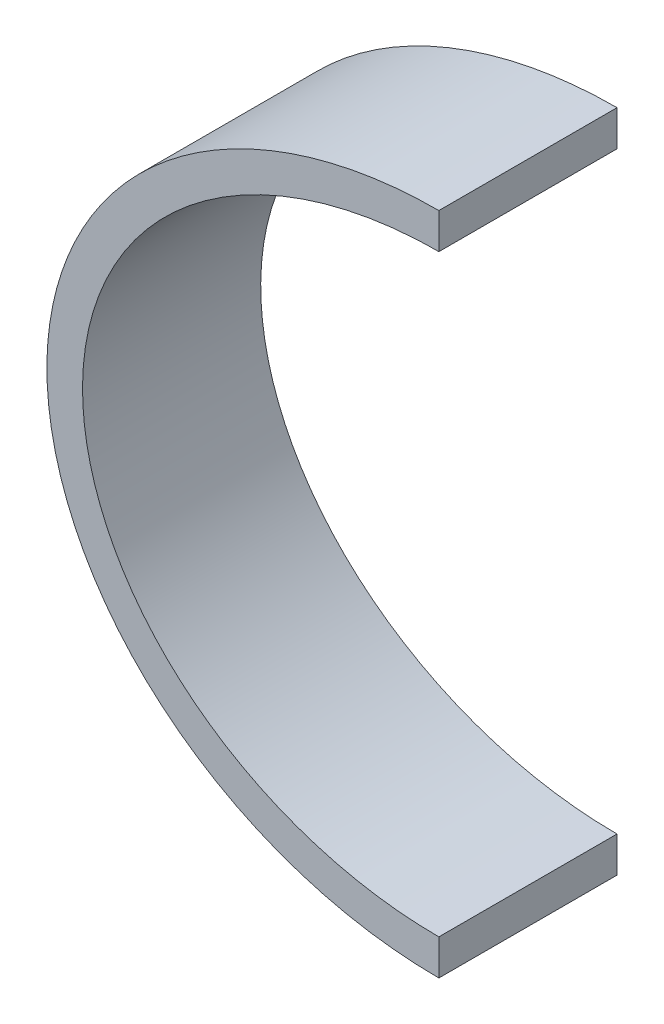
ISO-10303-21;
HEADER;
FILE_DESCRIPTION(('STEP AP214'),'2;1');
FILE_NAME('part.step','',(''),(''),'','','');
FILE_SCHEMA(('AUTOMOTIVE_DESIGN { 1 0 10303 214 1 1 1 1 }'));
ENDSEC;
DATA;
#1=APPLICATION_CONTEXT('core data for automotive mechanical design processes');
#2=APPLICATION_PROTOCOL_DEFINITION('international standard','automotive_design',2000,#1);
#3=PRODUCT_CONTEXT('',#1,'mechanical');
#4=PRODUCT('Part','Part','',(#3));
#5=PRODUCT_RELATED_PRODUCT_CATEGORY('part','',(#4));
#6=PRODUCT_DEFINITION_FORMATION('','',#4);
#7=PRODUCT_DEFINITION_CONTEXT('part definition',#1,'design');
#8=PRODUCT_DEFINITION('design','',#6,#7);
#9=PRODUCT_DEFINITION_SHAPE('','',#8);
#10=(LENGTH_UNIT() NAMED_UNIT(*) SI_UNIT(.MILLI.,.METRE.));
#11=(NAMED_UNIT(*) PLANE_ANGLE_UNIT() SI_UNIT($,.RADIAN.));
#12=(NAMED_UNIT(*) SI_UNIT($,.STERADIAN.) SOLID_ANGLE_UNIT());
#13=UNCERTAINTY_MEASURE_WITH_UNIT(LENGTH_MEASURE(1.E-05),#10,'distance_accuracy_value','');
#14=(GEOMETRIC_REPRESENTATION_CONTEXT(3) GLOBAL_UNCERTAINTY_ASSIGNED_CONTEXT((#13)) GLOBAL_UNIT_ASSIGNED_CONTEXT((#10,
#11,#12)) REPRESENTATION_CONTEXT('',''));
#15=CARTESIAN_POINT('',(0.,0.,0.));
#16=DIRECTION('',(0.,0.,1.));
#17=DIRECTION('',(1.,0.,0.));
#18=AXIS2_PLACEMENT_3D('',#15,#16,#17);
#19=CARTESIAN_POINT('',(0.,0.,5.));
#20=DIRECTION('',(0.,0.,1.));
#21=DIRECTION('',(-1.,0.,0.));
#22=AXIS2_PLACEMENT_3D('',#19,#20,#21);
#23=ELLIPSE('',#22,11.,9.32608695652174);
#24=DIRECTION('',(0.,0.,-1.));
#25=VECTOR('',#24,1.);
#26=SURFACE_OF_LINEAR_EXTRUSION('',#23,#25);
#27=CARTESIAN_POINT('',(0.,0.,0.));
#28=DIRECTION('',(0.,0.,1.));
#29=DIRECTION('',(-1.,0.,0.));
#30=AXIS2_PLACEMENT_3D('',#27,#28,#29);
#31=ELLIPSE('',#30,11.,9.32608695652174);
#32=CARTESIAN_POINT('',(0.,9.32608695652174,0.));
#33=VERTEX_POINT('',#32);
#34=CARTESIAN_POINT('',(0.,-9.32608695652174,0.));
#35=VERTEX_POINT('',#34);
#36=EDGE_CURVE('E111',#33,#35,#31,.T.);
#37=ORIENTED_EDGE('',*,*,#36,.T.);
#38=DIRECTION('',(0.,0.,-1.));
#39=VECTOR('',#38,1.);
#40=CARTESIAN_POINT('',(0.,-9.32608695652174,5.));
#41=LINE('',#40,#39);
#42=CARTESIAN_POINT('',(0.,-9.32608695652174,5.));
#43=VERTEX_POINT('',#42);
#44=EDGE_CURVE('E11',#43,#35,#41,.T.);
#45=ORIENTED_EDGE('',*,*,#44,.F.);
#46=CARTESIAN_POINT('',(0.,9.32608695652174,5.));
#47=VERTEX_POINT('',#46);
#48=EDGE_CURVE('E85',#47,#43,#23,.T.);
#49=ORIENTED_EDGE('',*,*,#48,.F.);
#50=DIRECTION('',(0.,0.,-1.));
#51=VECTOR('',#50,1.);
#52=CARTESIAN_POINT('',(0.,9.32608695652174,5.));
#53=LINE('',#52,#51);
#54=EDGE_CURVE('E93',#47,#33,#53,.T.);
#55=ORIENTED_EDGE('',*,*,#54,.T.);
#56=EDGE_LOOP('',(#37,#45,#49,#55));
#57=FACE_BOUND('',#56,.T.);
#58=ADVANCED_FACE('F33',(#57),#26,.F.);
#59=CARTESIAN_POINT('',(0.,-8.32608695652174,5.));
#60=DIRECTION('',(-1.,0.,0.));
#61=DIRECTION('',(0.,-1.,0.));
#62=AXIS2_PLACEMENT_3D('',#59,#60,#61);
#63=PLANE('',#62);
#64=DIRECTION('',(0.,1.,0.));
#65=VECTOR('',#64,1.);
#66=CARTESIAN_POINT('',(0.,-8.32608695652174,0.));
#67=LINE('',#66,#65);
#68=CARTESIAN_POINT('',(0.,-8.32608695652174,0.));
#69=VERTEX_POINT('',#68);
#70=EDGE_CURVE('E89',#35,#69,#67,.T.);
#71=ORIENTED_EDGE('',*,*,#70,.T.);
#72=DIRECTION('',(0.,0.,-1.));
#73=VECTOR('',#72,1.);
#74=CARTESIAN_POINT('',(0.,-8.32608695652174,5.));
#75=LINE('',#74,#73);
#76=CARTESIAN_POINT('',(0.,-8.32608695652174,5.));
#77=VERTEX_POINT('',#76);
#78=EDGE_CURVE('E42',#77,#69,#75,.T.);
#79=ORIENTED_EDGE('',*,*,#78,.F.);
#80=DIRECTION('',(0.,1.,0.));
#81=VECTOR('',#80,1.);
#82=CARTESIAN_POINT('',(0.,-8.32608695652174,5.));
#83=LINE('',#82,#81);
#84=EDGE_CURVE('E80',#43,#77,#83,.T.);
#85=ORIENTED_EDGE('',*,*,#84,.F.);
#86=ORIENTED_EDGE('',*,*,#44,.T.);
#87=EDGE_LOOP('',(#71,#79,#85,#86));
#88=FACE_BOUND('',#87,.T.);
#89=ADVANCED_FACE('F88',(#88),#63,.F.);
#90=CARTESIAN_POINT('',(0.,0.,5.));
#91=DIRECTION('',(0.,0.,-1.));
#92=DIRECTION('',(-1.,0.,0.));
#93=AXIS2_PLACEMENT_3D('',#90,#91,#92);
#94=ELLIPSE('',#93,10.,8.32608695652174);
#95=DIRECTION('',(0.,0.,-1.));
#96=VECTOR('',#95,1.);
#97=SURFACE_OF_LINEAR_EXTRUSION('',#94,#96);
#98=CARTESIAN_POINT('',(0.,0.,0.));
#99=DIRECTION('',(0.,0.,-1.));
#100=DIRECTION('',(-1.,0.,0.));
#101=AXIS2_PLACEMENT_3D('',#98,#99,#100);
#102=ELLIPSE('',#101,10.,8.32608695652174);
#103=CARTESIAN_POINT('',(0.,8.32608695652174,0.));
#104=VERTEX_POINT('',#103);
#105=EDGE_CURVE('E67',#69,#104,#102,.T.);
#106=ORIENTED_EDGE('',*,*,#105,.T.);
#107=DIRECTION('',(0.,0.,-1.));
#108=VECTOR('',#107,1.);
#109=CARTESIAN_POINT('',(0.,8.32608695652174,5.));
#110=LINE('',#109,#108);
#111=CARTESIAN_POINT('',(0.,8.32608695652174,5.));
#112=VERTEX_POINT('',#111);
#113=EDGE_CURVE('E90',#112,#104,#110,.T.);
#114=ORIENTED_EDGE('',*,*,#113,.F.);
#115=EDGE_CURVE('E83',#77,#112,#94,.T.);
#116=ORIENTED_EDGE('',*,*,#115,.F.);
#117=ORIENTED_EDGE('',*,*,#78,.T.);
#118=EDGE_LOOP('',(#106,#114,#116,#117));
#119=FACE_BOUND('',#118,.T.);
#120=ADVANCED_FACE('F91',(#119),#97,.F.);
#121=CARTESIAN_POINT('',(0.,9.32608695652174,5.));
#122=DIRECTION('',(-1.,0.,0.));
#123=DIRECTION('',(0.,-1.,0.));
#124=AXIS2_PLACEMENT_3D('',#121,#122,#123);
#125=PLANE('',#124);
#126=DIRECTION('',(0.,1.,0.));
#127=VECTOR('',#126,1.);
#128=CARTESIAN_POINT('',(0.,9.32608695652174,0.));
#129=LINE('',#128,#127);
#130=EDGE_CURVE('E73',#104,#33,#129,.T.);
#131=ORIENTED_EDGE('',*,*,#130,.T.);
#132=ORIENTED_EDGE('',*,*,#54,.F.);
#133=DIRECTION('',(0.,1.,0.));
#134=VECTOR('',#133,1.);
#135=CARTESIAN_POINT('',(0.,9.32608695652174,5.));
#136=LINE('',#135,#134);
#137=EDGE_CURVE('E50',#112,#47,#136,.T.);
#138=ORIENTED_EDGE('',*,*,#137,.F.);
#139=ORIENTED_EDGE('',*,*,#113,.T.);
#140=EDGE_LOOP('',(#131,#132,#138,#139));
#141=FACE_BOUND('',#140,.T.);
#142=ADVANCED_FACE('F100',(#141),#125,.F.);
#143=CARTESIAN_POINT('',(0.,0.,5.));
#144=DIRECTION('',(0.,0.,1.));
#145=DIRECTION('',(1.,0.,0.));
#146=AXIS2_PLACEMENT_3D('',#143,#144,#145);
#147=PLANE('',#146);
#148=ORIENTED_EDGE('',*,*,#48,.T.);
#149=ORIENTED_EDGE('',*,*,#84,.T.);
#150=ORIENTED_EDGE('',*,*,#115,.T.);
#151=ORIENTED_EDGE('',*,*,#137,.T.);
#152=EDGE_LOOP('',(#148,#149,#150,#151));
#153=FACE_BOUND('',#152,.T.);
#154=ADVANCED_FACE('F81',(#153),#147,.T.);
#155=CARTESIAN_POINT('',(0.,0.,0.));
#156=DIRECTION('',(0.,0.,1.));
#157=DIRECTION('',(1.,0.,0.));
#158=AXIS2_PLACEMENT_3D('',#155,#156,#157);
#159=PLANE('',#158);
#160=ORIENTED_EDGE('',*,*,#36,.F.);
#161=ORIENTED_EDGE('',*,*,#130,.F.);
#162=ORIENTED_EDGE('',*,*,#105,.F.);
#163=ORIENTED_EDGE('',*,*,#70,.F.);
#164=EDGE_LOOP('',(#160,#161,#162,#163));
#165=FACE_BOUND('',#164,.T.);
#166=ADVANCED_FACE('F118',(#165),#159,.F.);
#167=CLOSED_SHELL('',(#58,#89,#120,#142,#154,#166));
#168=MANIFOLD_SOLID_BREP('B2',#167);
#169=ADVANCED_BREP_SHAPE_REPRESENTATION('',(#18,#168),#14);
#170=SHAPE_DEFINITION_REPRESENTATION(#9,#169);
ENDSEC;
END-ISO-10303-21;
